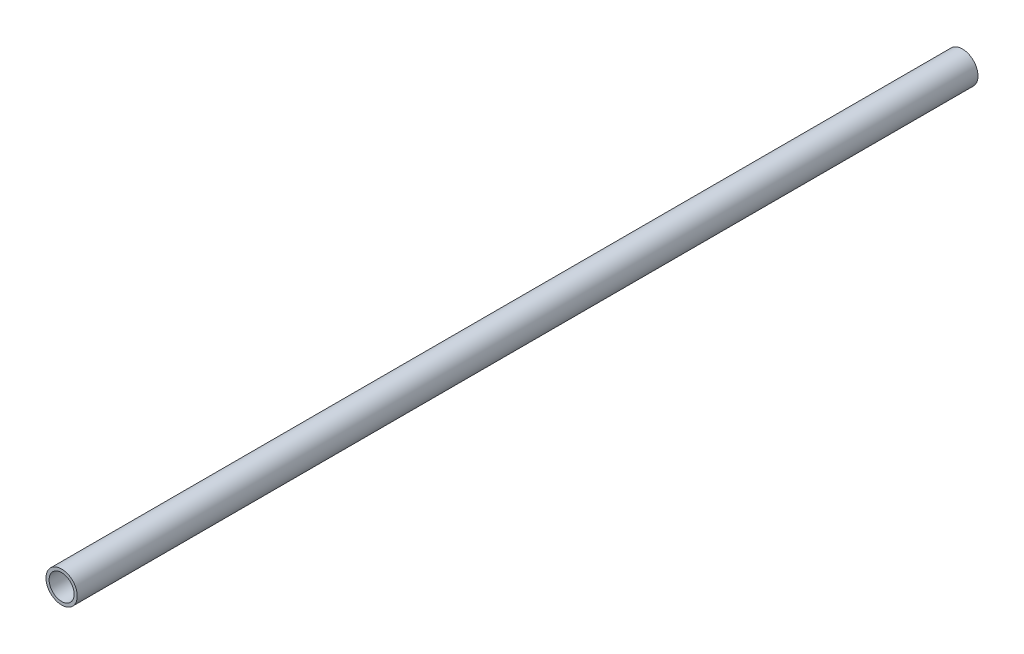
ISO-10303-21;
HEADER;
FILE_DESCRIPTION(('STEP AP214'),'2;1');
FILE_NAME('part.step','',(''),(''),'','','');
FILE_SCHEMA(('AUTOMOTIVE_DESIGN { 1 0 10303 214 1 1 1 1 }'));
ENDSEC;
DATA;
#1=APPLICATION_CONTEXT('core data for automotive mechanical design processes');
#2=APPLICATION_PROTOCOL_DEFINITION('international standard','automotive_design',2000,#1);
#3=PRODUCT_CONTEXT('',#1,'mechanical');
#4=PRODUCT('Part','Part','',(#3));
#5=PRODUCT_RELATED_PRODUCT_CATEGORY('part','',(#4));
#6=PRODUCT_DEFINITION_FORMATION('','',#4);
#7=PRODUCT_DEFINITION_CONTEXT('part definition',#1,'design');
#8=PRODUCT_DEFINITION('design','',#6,#7);
#9=PRODUCT_DEFINITION_SHAPE('','',#8);
#10=(LENGTH_UNIT() NAMED_UNIT(*) SI_UNIT(.MILLI.,.METRE.));
#11=(NAMED_UNIT(*) PLANE_ANGLE_UNIT() SI_UNIT($,.RADIAN.));
#12=(NAMED_UNIT(*) SI_UNIT($,.STERADIAN.) SOLID_ANGLE_UNIT());
#13=UNCERTAINTY_MEASURE_WITH_UNIT(LENGTH_MEASURE(1.E-05),#10,'distance_accuracy_value','');
#14=(GEOMETRIC_REPRESENTATION_CONTEXT(3) GLOBAL_UNCERTAINTY_ASSIGNED_CONTEXT((#13)) GLOBAL_UNIT_ASSIGNED_CONTEXT((#10,
#11,#12)) REPRESENTATION_CONTEXT('',''));
#15=CARTESIAN_POINT('',(0.,0.,0.));
#16=DIRECTION('',(0.,0.,1.));
#17=DIRECTION('',(1.,0.,0.));
#18=AXIS2_PLACEMENT_3D('',#15,#16,#17);
#19=CARTESIAN_POINT('',(0.,0.,457.2));
#20=DIRECTION('',(0.,0.,1.));
#21=DIRECTION('',(1.,0.,0.));
#22=AXIS2_PLACEMENT_3D('',#19,#20,#21);
#23=PLANE('',#22);
#24=CARTESIAN_POINT('',(0.,0.,457.2));
#25=DIRECTION('',(0.,0.,1.));
#26=DIRECTION('',(1.,0.,0.));
#27=AXIS2_PLACEMENT_3D('',#24,#25,#26);
#28=CIRCLE('',#27,15.875);
#29=CARTESIAN_POINT('',(15.875,0.,457.2));
#30=VERTEX_POINT('',#29);
#31=EDGE_CURVE('E10',#30,#30,#28,.T.);
#32=ORIENTED_EDGE('',*,*,#31,.T.);
#33=EDGE_LOOP('',(#32));
#34=FACE_BOUND('',#33,.T.);
#35=CARTESIAN_POINT('',(0.,0.,457.2));
#36=DIRECTION('',(0.,0.,1.));
#37=DIRECTION('',(1.,0.,0.));
#38=AXIS2_PLACEMENT_3D('',#35,#36,#37);
#39=CIRCLE('',#38,12.7);
#40=CARTESIAN_POINT('',(12.7,0.,457.2));
#41=VERTEX_POINT('',#40);
#42=EDGE_CURVE('E53',#41,#41,#39,.T.);
#43=ORIENTED_EDGE('',*,*,#42,.F.);
#44=EDGE_LOOP('',(#43));
#45=FACE_BOUND('',#44,.T.);
#46=ADVANCED_FACE('F39',(#34,#45),#23,.T.);
#47=CARTESIAN_POINT('',(0.,0.,-457.2));
#48=DIRECTION('',(0.,0.,1.));
#49=DIRECTION('',(1.,0.,0.));
#50=AXIS2_PLACEMENT_3D('',#47,#48,#49);
#51=PLANE('',#50);
#52=CARTESIAN_POINT('',(0.,0.,-457.2));
#53=DIRECTION('',(0.,0.,1.));
#54=DIRECTION('',(1.,0.,0.));
#55=AXIS2_PLACEMENT_3D('',#52,#53,#54);
#56=CIRCLE('',#55,15.875);
#57=CARTESIAN_POINT('',(15.875,0.,-457.2));
#58=VERTEX_POINT('',#57);
#59=EDGE_CURVE('E43',#58,#58,#56,.T.);
#60=ORIENTED_EDGE('',*,*,#59,.F.);
#61=EDGE_LOOP('',(#60));
#62=FACE_BOUND('',#61,.T.);
#63=CARTESIAN_POINT('',(0.,0.,-457.2));
#64=DIRECTION('',(0.,0.,1.));
#65=DIRECTION('',(1.,0.,0.));
#66=AXIS2_PLACEMENT_3D('',#63,#64,#65);
#67=CIRCLE('',#66,12.7);
#68=CARTESIAN_POINT('',(12.7,0.,-457.2));
#69=VERTEX_POINT('',#68);
#70=EDGE_CURVE('E55',#69,#69,#67,.T.);
#71=ORIENTED_EDGE('',*,*,#70,.T.);
#72=EDGE_LOOP('',(#71));
#73=FACE_BOUND('',#72,.T.);
#74=ADVANCED_FACE('F68',(#62,#73),#51,.F.);
#75=CARTESIAN_POINT('',(0.,0.,457.2));
#76=DIRECTION('',(0.,0.,-1.));
#77=DIRECTION('',(-1.,0.,0.));
#78=AXIS2_PLACEMENT_3D('',#75,#76,#77);
#79=CYLINDRICAL_SURFACE('',#78,15.875);
#80=ORIENTED_EDGE('',*,*,#31,.F.);
#81=EDGE_LOOP('',(#80));
#82=FACE_BOUND('',#81,.T.);
#83=ORIENTED_EDGE('',*,*,#59,.T.);
#84=EDGE_LOOP('',(#83));
#85=FACE_BOUND('',#84,.T.);
#86=ADVANCED_FACE('F41',(#82,#85),#79,.T.);
#87=CARTESIAN_POINT('',(0.,0.,457.2));
#88=DIRECTION('',(0.,0.,-1.));
#89=DIRECTION('',(-1.,0.,0.));
#90=AXIS2_PLACEMENT_3D('',#87,#88,#89);
#91=CYLINDRICAL_SURFACE('',#90,12.7);
#92=ORIENTED_EDGE('',*,*,#42,.T.);
#93=EDGE_LOOP('',(#92));
#94=FACE_BOUND('',#93,.T.);
#95=ORIENTED_EDGE('',*,*,#70,.F.);
#96=EDGE_LOOP('',(#95));
#97=FACE_BOUND('',#96,.T.);
#98=ADVANCED_FACE('F64',(#94,#97),#91,.F.);
#99=CLOSED_SHELL('',(#46,#74,#86,#98));
#100=MANIFOLD_SOLID_BREP('B2',#99);
#101=ADVANCED_BREP_SHAPE_REPRESENTATION('',(#18,#100),#14);
#102=SHAPE_DEFINITION_REPRESENTATION(#9,#101);
ENDSEC;
END-ISO-10303-21;
